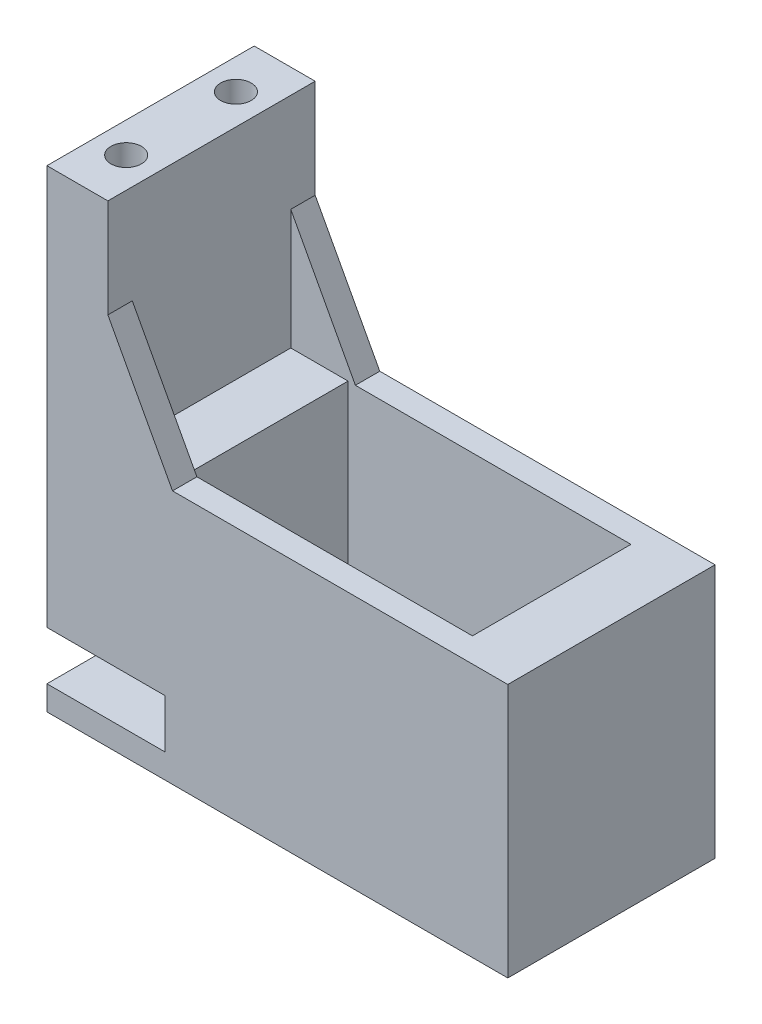
ISO-10303-21;
HEADER;
FILE_DESCRIPTION(('STEP AP214'),'2;1');
FILE_NAME('part.step','',(''),(''),'','','');
FILE_SCHEMA(('AUTOMOTIVE_DESIGN { 1 0 10303 214 1 1 1 1 }'));
ENDSEC;
DATA;
#1=APPLICATION_CONTEXT('core data for automotive mechanical design processes');
#2=APPLICATION_PROTOCOL_DEFINITION('international standard','automotive_design',2000,#1);
#3=PRODUCT_CONTEXT('',#1,'mechanical');
#4=PRODUCT('Part','Part','',(#3));
#5=PRODUCT_RELATED_PRODUCT_CATEGORY('part','',(#4));
#6=PRODUCT_DEFINITION_FORMATION('','',#4);
#7=PRODUCT_DEFINITION_CONTEXT('part definition',#1,'design');
#8=PRODUCT_DEFINITION('design','',#6,#7);
#9=PRODUCT_DEFINITION_SHAPE('','',#8);
#10=(LENGTH_UNIT() NAMED_UNIT(*) SI_UNIT(.MILLI.,.METRE.));
#11=(NAMED_UNIT(*) PLANE_ANGLE_UNIT() SI_UNIT($,.RADIAN.));
#12=(NAMED_UNIT(*) SI_UNIT($,.STERADIAN.) SOLID_ANGLE_UNIT());
#13=UNCERTAINTY_MEASURE_WITH_UNIT(LENGTH_MEASURE(1.E-05),#10,'distance_accuracy_value','');
#14=(GEOMETRIC_REPRESENTATION_CONTEXT(3) GLOBAL_UNCERTAINTY_ASSIGNED_CONTEXT((#13)) GLOBAL_UNIT_ASSIGNED_CONTEXT((#10,
#11,#12)) REPRESENTATION_CONTEXT('',''));
#15=CARTESIAN_POINT('',(0.,0.,0.));
#16=DIRECTION('',(0.,0.,1.));
#17=DIRECTION('',(1.,0.,0.));
#18=AXIS2_PLACEMENT_3D('',#15,#16,#17);
#19=CARTESIAN_POINT('',(-11.,5.15,8.5));
#20=DIRECTION('',(-0.880614595688984,-0.473833234228591,0.));
#21=DIRECTION('',(0.473833234228591,-0.880614595688984,0.));
#22=AXIS2_PLACEMENT_3D('',#19,#20,#21);
#23=PLANE('',#22);
#24=DIRECTION('',(0.,0.,-1.));
#25=VECTOR('',#24,1.);
#26=CARTESIAN_POINT('',(-16.3,15.,8.5));
#27=LINE('',#26,#25);
#28=CARTESIAN_POINT('',(-16.3,15.,-6.5));
#29=VERTEX_POINT('',#28);
#30=CARTESIAN_POINT('',(-16.3,15.,-8.5));
#31=VERTEX_POINT('',#30);
#32=EDGE_CURVE('E214',#29,#31,#27,.T.);
#33=ORIENTED_EDGE('',*,*,#32,.F.);
#34=DIRECTION('',(0.473833234228591,-0.880614595688984,0.));
#35=VECTOR('',#34,1.);
#36=CARTESIAN_POINT('',(-11.,5.15,-6.5));
#37=LINE('',#36,#35);
#38=CARTESIAN_POINT('',(-11.,5.15,-6.5));
#39=VERTEX_POINT('',#38);
#40=EDGE_CURVE('E342',#29,#39,#37,.T.);
#41=ORIENTED_EDGE('',*,*,#40,.T.);
#42=DIRECTION('',(0.,0.,-1.));
#43=VECTOR('',#42,1.);
#44=CARTESIAN_POINT('',(-11.,5.15,8.5));
#45=LINE('',#44,#43);
#46=CARTESIAN_POINT('',(-11.,5.15,-8.5));
#47=VERTEX_POINT('',#46);
#48=EDGE_CURVE('E218',#39,#47,#45,.T.);
#49=ORIENTED_EDGE('',*,*,#48,.T.);
#50=DIRECTION('',(-0.473833234228591,0.880614595688984,0.));
#51=VECTOR('',#50,1.);
#52=CARTESIAN_POINT('',(-11.,5.15,-8.5));
#53=LINE('',#52,#51);
#54=EDGE_CURVE('E210',#47,#31,#53,.T.);
#55=ORIENTED_EDGE('',*,*,#54,.T.);
#56=EDGE_LOOP('',(#33,#41,#49,#55));
#57=FACE_BOUND('',#56,.T.);
#58=ADVANCED_FACE('F37',(#57),#23,.F.);
#59=CARTESIAN_POINT('',(-21.3,5.15,8.5));
#60=DIRECTION('',(0.,-1.,0.));
#61=DIRECTION('',(0.,0.,-1.));
#62=AXIS2_PLACEMENT_3D('',#59,#60,#61);
#63=PLANE('',#62);
#64=CARTESIAN_POINT('',(-11.,5.15,8.5));
#65=VERTEX_POINT('',#64);
#66=CARTESIAN_POINT('',(-11.,5.15,6.5));
#67=VERTEX_POINT('',#66);
#68=EDGE_CURVE('E219',#65,#67,#45,.T.);
#69=ORIENTED_EDGE('',*,*,#68,.F.);
#70=DIRECTION('',(-1.,0.,0.));
#71=VECTOR('',#70,1.);
#72=CARTESIAN_POINT('',(-21.3,5.15,8.5));
#73=LINE('',#72,#71);
#74=CARTESIAN_POINT('',(16.5,5.15,8.5));
#75=VERTEX_POINT('',#74);
#76=EDGE_CURVE('E318',#75,#65,#73,.T.);
#77=ORIENTED_EDGE('',*,*,#76,.F.);
#78=DIRECTION('',(0.,0.,-1.));
#79=VECTOR('',#78,1.);
#80=CARTESIAN_POINT('',(16.5,5.15,8.5));
#81=LINE('',#80,#79);
#82=CARTESIAN_POINT('',(16.5,5.15,-8.5));
#83=VERTEX_POINT('',#82);
#84=EDGE_CURVE('E321',#75,#83,#81,.T.);
#85=ORIENTED_EDGE('',*,*,#84,.T.);
#86=DIRECTION('',(-1.,0.,0.));
#87=VECTOR('',#86,1.);
#88=CARTESIAN_POINT('',(-21.3,5.15,-8.5));
#89=LINE('',#88,#87);
#90=EDGE_CURVE('E329',#83,#47,#89,.T.);
#91=ORIENTED_EDGE('',*,*,#90,.T.);
#92=ORIENTED_EDGE('',*,*,#48,.F.);
#93=DIRECTION('',(-1.,0.,0.));
#94=VECTOR('',#93,1.);
#95=CARTESIAN_POINT('',(-11.6,5.15,-6.5));
#96=LINE('',#95,#94);
#97=CARTESIAN_POINT('',(11.6,5.15,-6.5));
#98=VERTEX_POINT('',#97);
#99=EDGE_CURVE('E272',#98,#39,#96,.T.);
#100=ORIENTED_EDGE('',*,*,#99,.F.);
#101=DIRECTION('',(0.,0.,-1.));
#102=VECTOR('',#101,1.);
#103=CARTESIAN_POINT('',(11.6,5.15,6.5));
#104=LINE('',#103,#102);
#105=CARTESIAN_POINT('',(11.6,5.15,6.5));
#106=VERTEX_POINT('',#105);
#107=EDGE_CURVE('E278',#106,#98,#104,.T.);
#108=ORIENTED_EDGE('',*,*,#107,.F.);
#109=DIRECTION('',(1.,0.,0.));
#110=VECTOR('',#109,1.);
#111=CARTESIAN_POINT('',(-11.6,5.15,6.5));
#112=LINE('',#111,#110);
#113=EDGE_CURVE('E276',#67,#106,#112,.T.);
#114=ORIENTED_EDGE('',*,*,#113,.F.);
#115=EDGE_LOOP('',(#69,#77,#85,#91,#92,#100,#108,#114));
#116=FACE_BOUND('',#115,.T.);
#117=ADVANCED_FACE('F385',(#116),#63,.F.);
#118=CARTESIAN_POINT('',(-16.3,5.15,8.5));
#119=DIRECTION('',(-1.,0.,0.));
#120=DIRECTION('',(0.,0.,1.));
#121=AXIS2_PLACEMENT_3D('',#118,#119,#120);
#122=PLANE('',#121);
#123=CARTESIAN_POINT('',(-16.3,15.,8.5));
#124=VERTEX_POINT('',#123);
#125=CARTESIAN_POINT('',(-16.3,15.,6.5));
#126=VERTEX_POINT('',#125);
#127=EDGE_CURVE('E186',#124,#126,#27,.T.);
#128=ORIENTED_EDGE('',*,*,#127,.T.);
#129=DIRECTION('',(0.,1.,0.));
#130=VECTOR('',#129,1.);
#131=CARTESIAN_POINT('',(-16.3,5.15,6.5));
#132=LINE('',#131,#130);
#133=CARTESIAN_POINT('',(-16.3,5.15,6.5));
#134=VERTEX_POINT('',#133);
#135=EDGE_CURVE('E179',#134,#126,#132,.T.);
#136=ORIENTED_EDGE('',*,*,#135,.F.);
#137=DIRECTION('',(0.,0.,1.));
#138=VECTOR('',#137,1.);
#139=CARTESIAN_POINT('',(-16.3,5.15,6.5));
#140=LINE('',#139,#138);
#141=CARTESIAN_POINT('',(-16.3,5.15,-6.5));
#142=VERTEX_POINT('',#141);
#143=EDGE_CURVE('E183',#142,#134,#140,.T.);
#144=ORIENTED_EDGE('',*,*,#143,.F.);
#145=DIRECTION('',(0.,1.,0.));
#146=VECTOR('',#145,1.);
#147=CARTESIAN_POINT('',(-16.3,5.15,-6.5));
#148=LINE('',#147,#146);
#149=EDGE_CURVE('E52',#142,#29,#148,.T.);
#150=ORIENTED_EDGE('',*,*,#149,.T.);
#151=ORIENTED_EDGE('',*,*,#32,.T.);
#152=DIRECTION('',(0.,1.,0.));
#153=VECTOR('',#152,1.);
#154=CARTESIAN_POINT('',(-16.3,5.15,-8.5));
#155=LINE('',#154,#153);
#156=CARTESIAN_POINT('',(-16.3,23.1,-8.5));
#157=VERTEX_POINT('',#156);
#158=EDGE_CURVE('E285',#31,#157,#155,.T.);
#159=ORIENTED_EDGE('',*,*,#158,.T.);
#160=DIRECTION('',(0.,0.,-1.));
#161=VECTOR('',#160,1.);
#162=CARTESIAN_POINT('',(-16.3,23.1,8.5));
#163=LINE('',#162,#161);
#164=CARTESIAN_POINT('',(-16.3,23.1,8.5));
#165=VERTEX_POINT('',#164);
#166=EDGE_CURVE('E306',#165,#157,#163,.T.);
#167=ORIENTED_EDGE('',*,*,#166,.F.);
#168=DIRECTION('',(0.,1.,0.));
#169=VECTOR('',#168,1.);
#170=CARTESIAN_POINT('',(-16.3,5.15,8.5));
#171=LINE('',#170,#169);
#172=EDGE_CURVE('E294',#124,#165,#171,.T.);
#173=ORIENTED_EDGE('',*,*,#172,.F.);
#174=EDGE_LOOP('',(#128,#136,#144,#150,#151,#159,#167,#173));
#175=FACE_BOUND('',#174,.T.);
#176=ADVANCED_FACE('F181',(#175),#122,.F.);
#177=CARTESIAN_POINT('',(-21.3,-15.7,8.5));
#178=DIRECTION('',(1.,0.,0.));
#179=DIRECTION('',(0.,0.,-1.));
#180=AXIS2_PLACEMENT_3D('',#177,#178,#179);
#181=PLANE('',#180);
#182=CARTESIAN_POINT('',(-21.3,4.,-4.));
#183=DIRECTION('',(1.,0.,0.));
#184=DIRECTION('',(0.,0.,-1.));
#185=AXIS2_PLACEMENT_3D('',#182,#183,#184);
#186=CIRCLE('',#185,1.5);
#187=CARTESIAN_POINT('',(-21.3,4.,-5.5));
#188=VERTEX_POINT('',#187);
#189=EDGE_CURVE('E11',#188,#188,#186,.F.);
#190=ORIENTED_EDGE('',*,*,#189,.F.);
#191=EDGE_LOOP('',(#190));
#192=FACE_BOUND('',#191,.T.);
#193=CARTESIAN_POINT('',(-21.3,4.,4.));
#194=DIRECTION('',(1.,0.,0.));
#195=DIRECTION('',(0.,0.,-1.));
#196=AXIS2_PLACEMENT_3D('',#193,#194,#195);
#197=CIRCLE('',#196,1.5);
#198=CARTESIAN_POINT('',(-21.3,4.,2.5));
#199=VERTEX_POINT('',#198);
#200=EDGE_CURVE('E45',#199,#199,#197,.F.);
#201=ORIENTED_EDGE('',*,*,#200,.F.);
#202=EDGE_LOOP('',(#201));
#203=FACE_BOUND('',#202,.T.);
#204=CARTESIAN_POINT('',(-21.3,-4.,-4.));
#205=DIRECTION('',(1.,0.,0.));
#206=DIRECTION('',(0.,0.,-1.));
#207=AXIS2_PLACEMENT_3D('',#204,#205,#206);
#208=CIRCLE('',#207,1.5);
#209=CARTESIAN_POINT('',(-21.3,-4.,-5.5));
#210=VERTEX_POINT('',#209);
#211=EDGE_CURVE('E350',#210,#210,#208,.F.);
#212=ORIENTED_EDGE('',*,*,#211,.F.);
#213=EDGE_LOOP('',(#212));
#214=FACE_BOUND('',#213,.T.);
#215=CARTESIAN_POINT('',(-21.3,-4.,4.));
#216=DIRECTION('',(1.,0.,0.));
#217=DIRECTION('',(0.,0.,-1.));
#218=AXIS2_PLACEMENT_3D('',#215,#216,#217);
#219=CIRCLE('',#218,1.5);
#220=CARTESIAN_POINT('',(-21.3,-4.,2.5));
#221=VERTEX_POINT('',#220);
#222=EDGE_CURVE('E347',#221,#221,#219,.F.);
#223=ORIENTED_EDGE('',*,*,#222,.F.);
#224=EDGE_LOOP('',(#223));
#225=FACE_BOUND('',#224,.T.);
#226=DIRECTION('',(0.,-1.,0.));
#227=VECTOR('',#226,1.);
#228=CARTESIAN_POINT('',(-21.3,-15.7,-8.5));
#229=LINE('',#228,#227);
#230=CARTESIAN_POINT('',(-21.3,23.1,-8.5));
#231=VERTEX_POINT('',#230);
#232=CARTESIAN_POINT('',(-21.3,-9.7,-8.5));
#233=VERTEX_POINT('',#232);
#234=EDGE_CURVE('E322',#231,#233,#229,.T.);
#235=ORIENTED_EDGE('',*,*,#234,.T.);
#236=DIRECTION('',(0.,0.,1.));
#237=VECTOR('',#236,1.);
#238=CARTESIAN_POINT('',(-21.3,-9.7,-8.5));
#239=LINE('',#238,#237);
#240=CARTESIAN_POINT('',(-21.3,-9.7,8.5));
#241=VERTEX_POINT('',#240);
#242=EDGE_CURVE('E238',#233,#241,#239,.T.);
#243=ORIENTED_EDGE('',*,*,#242,.T.);
#244=DIRECTION('',(0.,-1.,0.));
#245=VECTOR('',#244,1.);
#246=CARTESIAN_POINT('',(-21.3,-15.7,8.5));
#247=LINE('',#246,#245);
#248=CARTESIAN_POINT('',(-21.3,23.1,8.5));
#249=VERTEX_POINT('',#248);
#250=EDGE_CURVE('E310',#249,#241,#247,.T.);
#251=ORIENTED_EDGE('',*,*,#250,.F.);
#252=DIRECTION('',(0.,0.,-1.));
#253=VECTOR('',#252,1.);
#254=CARTESIAN_POINT('',(-21.3,23.1,8.5));
#255=LINE('',#254,#253);
#256=EDGE_CURVE('E300',#249,#231,#255,.T.);
#257=ORIENTED_EDGE('',*,*,#256,.T.);
#258=EDGE_LOOP('',(#235,#243,#251,#257));
#259=FACE_BOUND('',#258,.T.);
#260=ADVANCED_FACE('F358',(#192,#203,#214,#225,#259),#181,.F.);
#261=CARTESIAN_POINT('',(11.6,-13.7,6.5));
#262=DIRECTION('',(1.,0.,0.));
#263=DIRECTION('',(0.,0.,-1.));
#264=AXIS2_PLACEMENT_3D('',#261,#262,#263);
#265=PLANE('',#264);
#266=DIRECTION('',(0.,0.,1.));
#267=VECTOR('',#266,1.);
#268=CARTESIAN_POINT('',(11.6,-7.9,6.5));
#269=LINE('',#268,#267);
#270=CARTESIAN_POINT('',(11.6,-7.9,-6.5));
#271=VERTEX_POINT('',#270);
#272=CARTESIAN_POINT('',(11.6,-7.9,6.5));
#273=VERTEX_POINT('',#272);
#274=EDGE_CURVE('E251',#271,#273,#269,.T.);
#275=ORIENTED_EDGE('',*,*,#274,.T.);
#276=DIRECTION('',(0.,1.,0.));
#277=VECTOR('',#276,1.);
#278=CARTESIAN_POINT('',(11.6,-13.7,6.5));
#279=LINE('',#278,#277);
#280=EDGE_CURVE('E289',#273,#106,#279,.T.);
#281=ORIENTED_EDGE('',*,*,#280,.T.);
#282=ORIENTED_EDGE('',*,*,#107,.T.);
#283=DIRECTION('',(0.,1.,0.));
#284=VECTOR('',#283,1.);
#285=CARTESIAN_POINT('',(11.6,-13.7,-6.5));
#286=LINE('',#285,#284);
#287=EDGE_CURVE('E287',#271,#98,#286,.T.);
#288=ORIENTED_EDGE('',*,*,#287,.F.);
#289=EDGE_LOOP('',(#275,#281,#282,#288));
#290=FACE_BOUND('',#289,.T.);
#291=ADVANCED_FACE('F361',(#290),#265,.F.);
#292=CARTESIAN_POINT('',(-21.3,-13.7,8.5));
#293=VERTEX_POINT('',#292);
#294=CARTESIAN_POINT('',(-21.3,-15.7,8.5));
#295=VERTEX_POINT('',#294);
#296=EDGE_CURVE('E314',#293,#295,#247,.T.);
#297=ORIENTED_EDGE('',*,*,#296,.F.);
#298=DIRECTION('',(0.,0.,1.));
#299=VECTOR('',#298,1.);
#300=CARTESIAN_POINT('',(-21.3,-13.7,-8.5));
#301=LINE('',#300,#299);
#302=CARTESIAN_POINT('',(-21.3,-13.7,-8.5));
#303=VERTEX_POINT('',#302);
#304=EDGE_CURVE('E237',#303,#293,#301,.T.);
#305=ORIENTED_EDGE('',*,*,#304,.F.);
#306=CARTESIAN_POINT('',(-21.3,-15.7,-8.5));
#307=VERTEX_POINT('',#306);
#308=EDGE_CURVE('E309',#303,#307,#229,.T.);
#309=ORIENTED_EDGE('',*,*,#308,.T.);
#310=DIRECTION('',(0.,0.,-1.));
#311=VECTOR('',#310,1.);
#312=CARTESIAN_POINT('',(-21.3,-15.7,8.5));
#313=LINE('',#312,#311);
#314=EDGE_CURVE('E337',#295,#307,#313,.T.);
#315=ORIENTED_EDGE('',*,*,#314,.F.);
#316=EDGE_LOOP('',(#297,#305,#309,#315));
#317=FACE_BOUND('',#316,.T.);
#318=ADVANCED_FACE('F39',(#317),#181,.F.);
#319=CARTESIAN_POINT('',(-21.3,-15.7,8.5));
#320=DIRECTION('',(0.,1.,0.));
#321=DIRECTION('',(0.,0.,1.));
#322=AXIS2_PLACEMENT_3D('',#319,#320,#321);
#323=PLANE('',#322);
#324=CARTESIAN_POINT('',(5.5,-15.7,0.));
#325=DIRECTION('',(0.,1.,0.));
#326=DIRECTION('',(0.,0.,1.));
#327=AXIS2_PLACEMENT_3D('',#324,#325,#326);
#328=CIRCLE('',#327,3.);
#329=CARTESIAN_POINT('',(5.5,-15.7,3.));
#330=VERTEX_POINT('',#329);
#331=EDGE_CURVE('E344',#330,#330,#328,.F.);
#332=ORIENTED_EDGE('',*,*,#331,.F.);
#333=EDGE_LOOP('',(#332));
#334=FACE_BOUND('',#333,.T.);
#335=DIRECTION('',(1.,0.,0.));
#336=VECTOR('',#335,1.);
#337=CARTESIAN_POINT('',(-21.3,-15.7,-8.5));
#338=LINE('',#337,#336);
#339=CARTESIAN_POINT('',(16.5,-15.7,-8.5));
#340=VERTEX_POINT('',#339);
#341=EDGE_CURVE('E325',#307,#340,#338,.T.);
#342=ORIENTED_EDGE('',*,*,#341,.T.);
#343=DIRECTION('',(0.,0.,-1.));
#344=VECTOR('',#343,1.);
#345=CARTESIAN_POINT('',(16.5,-15.7,8.5));
#346=LINE('',#345,#344);
#347=CARTESIAN_POINT('',(16.5,-15.7,8.5));
#348=VERTEX_POINT('',#347);
#349=EDGE_CURVE('E334',#348,#340,#346,.T.);
#350=ORIENTED_EDGE('',*,*,#349,.F.);
#351=DIRECTION('',(1.,0.,0.));
#352=VECTOR('',#351,1.);
#353=CARTESIAN_POINT('',(-21.3,-15.7,8.5));
#354=LINE('',#353,#352);
#355=EDGE_CURVE('E313',#295,#348,#354,.T.);
#356=ORIENTED_EDGE('',*,*,#355,.F.);
#357=ORIENTED_EDGE('',*,*,#314,.T.);
#358=EDGE_LOOP('',(#342,#350,#356,#357));
#359=FACE_BOUND('',#358,.T.);
#360=ADVANCED_FACE('F398',(#334,#359),#323,.F.);
#361=CARTESIAN_POINT('',(16.5,-15.7,8.5));
#362=DIRECTION('',(-1.,0.,0.));
#363=DIRECTION('',(0.,0.,1.));
#364=AXIS2_PLACEMENT_3D('',#361,#362,#363);
#365=PLANE('',#364);
#366=DIRECTION('',(0.,1.,0.));
#367=VECTOR('',#366,1.);
#368=CARTESIAN_POINT('',(16.5,-15.7,-8.5));
#369=LINE('',#368,#367);
#370=EDGE_CURVE('E327',#340,#83,#369,.T.);
#371=ORIENTED_EDGE('',*,*,#370,.T.);
#372=ORIENTED_EDGE('',*,*,#84,.F.);
#373=DIRECTION('',(0.,1.,0.));
#374=VECTOR('',#373,1.);
#375=CARTESIAN_POINT('',(16.5,-15.7,8.5));
#376=LINE('',#375,#374);
#377=EDGE_CURVE('E316',#348,#75,#376,.T.);
#378=ORIENTED_EDGE('',*,*,#377,.F.);
#379=ORIENTED_EDGE('',*,*,#349,.T.);
#380=EDGE_LOOP('',(#371,#372,#378,#379));
#381=FACE_BOUND('',#380,.T.);
#382=ADVANCED_FACE('F391',(#381),#365,.F.);
#383=CARTESIAN_POINT('',(0.,0.,8.5));
#384=DIRECTION('',(0.,0.,-1.));
#385=DIRECTION('',(-1.,0.,0.));
#386=AXIS2_PLACEMENT_3D('',#383,#384,#385);
#387=PLANE('',#386);
#388=ORIENTED_EDGE('',*,*,#76,.T.);
#389=DIRECTION('',(-0.473833234228591,0.880614595688984,0.));
#390=VECTOR('',#389,1.);
#391=CARTESIAN_POINT('',(-11.,5.15,8.5));
#392=LINE('',#391,#390);
#393=EDGE_CURVE('E212',#65,#124,#392,.T.);
#394=ORIENTED_EDGE('',*,*,#393,.T.);
#395=ORIENTED_EDGE('',*,*,#172,.T.);
#396=DIRECTION('',(-1.,0.,0.));
#397=VECTOR('',#396,1.);
#398=CARTESIAN_POINT('',(-21.3,23.1,8.5));
#399=LINE('',#398,#397);
#400=EDGE_CURVE('E296',#165,#249,#399,.T.);
#401=ORIENTED_EDGE('',*,*,#400,.T.);
#402=ORIENTED_EDGE('',*,*,#250,.T.);
#403=DIRECTION('',(-1.,0.,0.));
#404=VECTOR('',#403,1.);
#405=CARTESIAN_POINT('',(-21.3,-9.7,8.5));
#406=LINE('',#405,#404);
#407=CARTESIAN_POINT('',(-11.6,-9.7,8.5));
#408=VERTEX_POINT('',#407);
#409=EDGE_CURVE('E228',#408,#241,#406,.T.);
#410=ORIENTED_EDGE('',*,*,#409,.F.);
#411=DIRECTION('',(0.,1.,0.));
#412=VECTOR('',#411,1.);
#413=CARTESIAN_POINT('',(-11.6,-13.7,8.5));
#414=LINE('',#413,#412);
#415=CARTESIAN_POINT('',(-11.6,-13.7,8.5));
#416=VERTEX_POINT('',#415);
#417=EDGE_CURVE('E225',#416,#408,#414,.T.);
#418=ORIENTED_EDGE('',*,*,#417,.F.);
#419=DIRECTION('',(1.,0.,0.));
#420=VECTOR('',#419,1.);
#421=CARTESIAN_POINT('',(-21.3,-13.7,8.5));
#422=LINE('',#421,#420);
#423=EDGE_CURVE('E222',#293,#416,#422,.T.);
#424=ORIENTED_EDGE('',*,*,#423,.F.);
#425=ORIENTED_EDGE('',*,*,#296,.T.);
#426=ORIENTED_EDGE('',*,*,#355,.T.);
#427=ORIENTED_EDGE('',*,*,#377,.T.);
#428=EDGE_LOOP('',(#388,#394,#395,#401,#402,#410,#418,#424,#425,#426,#427));
#429=FACE_BOUND('',#428,.T.);
#430=ADVANCED_FACE('F407',(#429),#387,.F.);
#431=CARTESIAN_POINT('',(0.,0.,-8.5));
#432=DIRECTION('',(0.,0.,-1.));
#433=DIRECTION('',(-1.,0.,0.));
#434=AXIS2_PLACEMENT_3D('',#431,#432,#433);
#435=PLANE('',#434);
#436=ORIENTED_EDGE('',*,*,#54,.F.);
#437=ORIENTED_EDGE('',*,*,#90,.F.);
#438=ORIENTED_EDGE('',*,*,#370,.F.);
#439=ORIENTED_EDGE('',*,*,#341,.F.);
#440=ORIENTED_EDGE('',*,*,#308,.F.);
#441=DIRECTION('',(1.,0.,0.));
#442=VECTOR('',#441,1.);
#443=CARTESIAN_POINT('',(-21.3,-13.7,-8.5));
#444=LINE('',#443,#442);
#445=CARTESIAN_POINT('',(-11.6,-13.7,-8.5));
#446=VERTEX_POINT('',#445);
#447=EDGE_CURVE('E230',#303,#446,#444,.T.);
#448=ORIENTED_EDGE('',*,*,#447,.T.);
#449=DIRECTION('',(0.,1.,0.));
#450=VECTOR('',#449,1.);
#451=CARTESIAN_POINT('',(-11.6,-13.7,-8.5));
#452=LINE('',#451,#450);
#453=CARTESIAN_POINT('',(-11.6,-9.7,-8.5));
#454=VERTEX_POINT('',#453);
#455=EDGE_CURVE('E60',#446,#454,#452,.T.);
#456=ORIENTED_EDGE('',*,*,#455,.T.);
#457=DIRECTION('',(-1.,0.,0.));
#458=VECTOR('',#457,1.);
#459=CARTESIAN_POINT('',(-21.3,-9.7,-8.5));
#460=LINE('',#459,#458);
#461=EDGE_CURVE('E234',#454,#233,#460,.T.);
#462=ORIENTED_EDGE('',*,*,#461,.T.);
#463=ORIENTED_EDGE('',*,*,#234,.F.);
#464=DIRECTION('',(-1.,0.,0.));
#465=VECTOR('',#464,1.);
#466=CARTESIAN_POINT('',(-21.3,23.1,-8.5));
#467=LINE('',#466,#465);
#468=EDGE_CURVE('E297',#157,#231,#467,.T.);
#469=ORIENTED_EDGE('',*,*,#468,.F.);
#470=ORIENTED_EDGE('',*,*,#158,.F.);
#471=EDGE_LOOP('',(#436,#437,#438,#439,#440,#448,#456,#462,#463,#469,#470));
#472=FACE_BOUND('',#471,.T.);
#473=ADVANCED_FACE('F371',(#472),#435,.T.);
#474=CARTESIAN_POINT('',(-21.3,23.1,8.5));
#475=DIRECTION('',(0.,-1.,0.));
#476=DIRECTION('',(0.,0.,-1.));
#477=AXIS2_PLACEMENT_3D('',#474,#475,#476);
#478=PLANE('',#477);
#479=CARTESIAN_POINT('',(-18.8,23.1,-4.5));
#480=DIRECTION('',(0.,1.,0.));
#481=DIRECTION('',(0.,0.,1.));
#482=AXIS2_PLACEMENT_3D('',#479,#480,#481);
#483=CIRCLE('',#482,1.25);
#484=CARTESIAN_POINT('',(-18.8,23.1,-3.25));
#485=VERTEX_POINT('',#484);
#486=EDGE_CURVE('E538',#485,#485,#483,.T.);
#487=ORIENTED_EDGE('',*,*,#486,.F.);
#488=EDGE_LOOP('',(#487));
#489=FACE_BOUND('',#488,.T.);
#490=CARTESIAN_POINT('',(-18.8,23.1,4.5));
#491=DIRECTION('',(0.,1.,0.));
#492=DIRECTION('',(0.,0.,1.));
#493=AXIS2_PLACEMENT_3D('',#490,#491,#492);
#494=CIRCLE('',#493,1.25);
#495=CARTESIAN_POINT('',(-18.8,23.1,5.75));
#496=VERTEX_POINT('',#495);
#497=EDGE_CURVE('E542',#496,#496,#494,.T.);
#498=ORIENTED_EDGE('',*,*,#497,.F.);
#499=EDGE_LOOP('',(#498));
#500=FACE_BOUND('',#499,.T.);
#501=ORIENTED_EDGE('',*,*,#468,.T.);
#502=ORIENTED_EDGE('',*,*,#256,.F.);
#503=ORIENTED_EDGE('',*,*,#400,.F.);
#504=ORIENTED_EDGE('',*,*,#166,.T.);
#505=EDGE_LOOP('',(#501,#502,#503,#504));
#506=FACE_BOUND('',#505,.T.);
#507=ADVANCED_FACE('F375',(#489,#500,#506),#478,.F.);
#508=CARTESIAN_POINT('',(-11.6,-13.7,6.5));
#509=DIRECTION('',(-1.,0.,0.));
#510=DIRECTION('',(0.,0.,1.));
#511=AXIS2_PLACEMENT_3D('',#508,#509,#510);
#512=PLANE('',#511);
#513=DIRECTION('',(0.,1.,0.));
#514=VECTOR('',#513,1.);
#515=CARTESIAN_POINT('',(-11.6,-13.7,6.5));
#516=LINE('',#515,#514);
#517=CARTESIAN_POINT('',(-11.6,-9.7,6.5));
#518=VERTEX_POINT('',#517);
#519=CARTESIAN_POINT('',(-11.6,5.15,6.5));
#520=VERTEX_POINT('',#519);
#521=EDGE_CURVE('E196',#518,#520,#516,.T.);
#522=ORIENTED_EDGE('',*,*,#521,.F.);
#523=DIRECTION('',(0.,0.,1.));
#524=VECTOR('',#523,1.);
#525=CARTESIAN_POINT('',(-11.6,-9.7,-8.5));
#526=LINE('',#525,#524);
#527=CARTESIAN_POINT('',(-11.6,-9.7,-6.5));
#528=VERTEX_POINT('',#527);
#529=EDGE_CURVE('E245',#528,#518,#526,.T.);
#530=ORIENTED_EDGE('',*,*,#529,.F.);
#531=DIRECTION('',(0.,1.,0.));
#532=VECTOR('',#531,1.);
#533=CARTESIAN_POINT('',(-11.6,-13.7,-6.5));
#534=LINE('',#533,#532);
#535=CARTESIAN_POINT('',(-11.6,5.15,-6.5));
#536=VERTEX_POINT('',#535);
#537=EDGE_CURVE('E286',#528,#536,#534,.T.);
#538=ORIENTED_EDGE('',*,*,#537,.T.);
#539=DIRECTION('',(0.,0.,1.));
#540=VECTOR('',#539,1.);
#541=CARTESIAN_POINT('',(-11.6,5.15,6.5));
#542=LINE('',#541,#540);
#543=EDGE_CURVE('E268',#536,#520,#542,.T.);
#544=ORIENTED_EDGE('',*,*,#543,.T.);
#545=EDGE_LOOP('',(#522,#530,#538,#544));
#546=FACE_BOUND('',#545,.T.);
#547=ADVANCED_FACE('F551',(#546),#512,.F.);
#548=CARTESIAN_POINT('',(-11.6,-13.7,-6.5));
#549=DIRECTION('',(0.,0.,-1.));
#550=DIRECTION('',(-1.,0.,0.));
#551=AXIS2_PLACEMENT_3D('',#548,#549,#550);
#552=PLANE('',#551);
#553=ORIENTED_EDGE('',*,*,#99,.T.);
#554=ORIENTED_EDGE('',*,*,#40,.F.);
#555=ORIENTED_EDGE('',*,*,#149,.F.);
#556=DIRECTION('',(-1.,0.,0.));
#557=VECTOR('',#556,1.);
#558=CARTESIAN_POINT('',(-16.3,5.15,-6.5));
#559=LINE('',#558,#557);
#560=EDGE_CURVE('E189',#536,#142,#559,.T.);
#561=ORIENTED_EDGE('',*,*,#560,.F.);
#562=ORIENTED_EDGE('',*,*,#537,.F.);
#563=CARTESIAN_POINT('',(-11.6,-13.7,-6.5));
#564=VERTEX_POINT('',#563);
#565=EDGE_CURVE('E283',#564,#528,#534,.T.);
#566=ORIENTED_EDGE('',*,*,#565,.F.);
#567=DIRECTION('',(-1.,0.,0.));
#568=VECTOR('',#567,1.);
#569=CARTESIAN_POINT('',(-11.6,-13.7,-6.5));
#570=LINE('',#569,#568);
#571=CARTESIAN_POINT('',(13.,-13.7,-6.5));
#572=VERTEX_POINT('',#571);
#573=EDGE_CURVE('E271',#572,#564,#570,.T.);
#574=ORIENTED_EDGE('',*,*,#573,.F.);
#575=DIRECTION('',(0.,-1.,0.));
#576=VECTOR('',#575,1.);
#577=CARTESIAN_POINT('',(13.,-7.9,-6.5));
#578=LINE('',#577,#576);
#579=CARTESIAN_POINT('',(13.,-7.9,-6.5));
#580=VERTEX_POINT('',#579);
#581=EDGE_CURVE('E260',#580,#572,#578,.T.);
#582=ORIENTED_EDGE('',*,*,#581,.F.);
#583=DIRECTION('',(-1.,0.,0.));
#584=VECTOR('',#583,1.);
#585=CARTESIAN_POINT('',(11.6,-7.9,-6.5));
#586=LINE('',#585,#584);
#587=EDGE_CURVE('E258',#580,#271,#586,.T.);
#588=ORIENTED_EDGE('',*,*,#587,.T.);
#589=ORIENTED_EDGE('',*,*,#287,.T.);
#590=EDGE_LOOP('',(#553,#554,#555,#561,#562,#566,#574,#582,#588,#589));
#591=FACE_BOUND('',#590,.T.);
#592=ADVANCED_FACE('F423',(#591),#552,.F.);
#593=CARTESIAN_POINT('',(-11.6,-13.7,6.5));
#594=DIRECTION('',(0.,0.,1.));
#595=DIRECTION('',(1.,0.,0.));
#596=AXIS2_PLACEMENT_3D('',#593,#594,#595);
#597=PLANE('',#596);
#598=ORIENTED_EDGE('',*,*,#521,.T.);
#599=DIRECTION('',(1.,0.,0.));
#600=VECTOR('',#599,1.);
#601=CARTESIAN_POINT('',(-16.3,5.15,6.5));
#602=LINE('',#601,#600);
#603=EDGE_CURVE('E192',#134,#520,#602,.T.);
#604=ORIENTED_EDGE('',*,*,#603,.F.);
#605=ORIENTED_EDGE('',*,*,#135,.T.);
#606=DIRECTION('',(-0.473833234228591,0.880614595688984,0.));
#607=VECTOR('',#606,1.);
#608=CARTESIAN_POINT('',(-11.,5.15,6.5));
#609=LINE('',#608,#607);
#610=EDGE_CURVE('E340',#67,#126,#609,.T.);
#611=ORIENTED_EDGE('',*,*,#610,.F.);
#612=ORIENTED_EDGE('',*,*,#113,.T.);
#613=ORIENTED_EDGE('',*,*,#280,.F.);
#614=DIRECTION('',(1.,0.,0.));
#615=VECTOR('',#614,1.);
#616=CARTESIAN_POINT('',(11.6,-7.9,6.5));
#617=LINE('',#616,#615);
#618=CARTESIAN_POINT('',(13.,-7.9,6.5));
#619=VERTEX_POINT('',#618);
#620=EDGE_CURVE('E254',#273,#619,#617,.T.);
#621=ORIENTED_EDGE('',*,*,#620,.T.);
#622=DIRECTION('',(0.,-1.,0.));
#623=VECTOR('',#622,1.);
#624=CARTESIAN_POINT('',(13.,-7.9,6.5));
#625=LINE('',#624,#623);
#626=CARTESIAN_POINT('',(13.,-13.7,6.5));
#627=VERTEX_POINT('',#626);
#628=EDGE_CURVE('E265',#619,#627,#625,.T.);
#629=ORIENTED_EDGE('',*,*,#628,.T.);
#630=DIRECTION('',(1.,0.,0.));
#631=VECTOR('',#630,1.);
#632=CARTESIAN_POINT('',(-11.6,-13.7,6.5));
#633=LINE('',#632,#631);
#634=CARTESIAN_POINT('',(-11.6,-13.7,6.5));
#635=VERTEX_POINT('',#634);
#636=EDGE_CURVE('E269',#635,#627,#633,.T.);
#637=ORIENTED_EDGE('',*,*,#636,.F.);
#638=EDGE_CURVE('E292',#635,#518,#516,.T.);
#639=ORIENTED_EDGE('',*,*,#638,.T.);
#640=EDGE_LOOP('',(#598,#604,#605,#611,#612,#613,#621,#629,#637,#639));
#641=FACE_BOUND('',#640,.T.);
#642=ADVANCED_FACE('F193',(#641),#597,.F.);
#643=CARTESIAN_POINT('',(0.,-13.7,0.));
#644=DIRECTION('',(0.,-1.,0.));
#645=DIRECTION('',(0.,0.,-1.));
#646=AXIS2_PLACEMENT_3D('',#643,#644,#645);
#647=PLANE('',#646);
#648=ORIENTED_EDGE('',*,*,#573,.T.);
#649=DIRECTION('',(0.,0.,1.));
#650=VECTOR('',#649,1.);
#651=CARTESIAN_POINT('',(-11.6,-13.7,-8.5));
#652=LINE('',#651,#650);
#653=EDGE_CURVE('E247',#446,#564,#652,.T.);
#654=ORIENTED_EDGE('',*,*,#653,.F.);
#655=ORIENTED_EDGE('',*,*,#447,.F.);
#656=ORIENTED_EDGE('',*,*,#304,.T.);
#657=ORIENTED_EDGE('',*,*,#423,.T.);
#658=EDGE_CURVE('E249',#635,#416,#652,.T.);
#659=ORIENTED_EDGE('',*,*,#658,.F.);
#660=ORIENTED_EDGE('',*,*,#636,.T.);
#661=DIRECTION('',(0.,0.,-1.));
#662=VECTOR('',#661,1.);
#663=CARTESIAN_POINT('',(13.,-13.7,6.5));
#664=LINE('',#663,#662);
#665=EDGE_CURVE('E241',#627,#572,#664,.T.);
#666=ORIENTED_EDGE('',*,*,#665,.T.);
#667=EDGE_LOOP('',(#648,#654,#655,#656,#657,#659,#660,#666));
#668=FACE_BOUND('',#667,.T.);
#669=ADVANCED_FACE('F404',(#668),#647,.F.);
#670=CARTESIAN_POINT('',(13.,-7.9,6.5));
#671=DIRECTION('',(-1.,0.,0.));
#672=DIRECTION('',(0.,0.,1.));
#673=AXIS2_PLACEMENT_3D('',#670,#671,#672);
#674=PLANE('',#673);
#675=ORIENTED_EDGE('',*,*,#665,.F.);
#676=ORIENTED_EDGE('',*,*,#628,.F.);
#677=DIRECTION('',(0.,0.,-1.));
#678=VECTOR('',#677,1.);
#679=CARTESIAN_POINT('',(13.,-7.9,6.5));
#680=LINE('',#679,#678);
#681=EDGE_CURVE('E256',#619,#580,#680,.T.);
#682=ORIENTED_EDGE('',*,*,#681,.T.);
#683=ORIENTED_EDGE('',*,*,#581,.T.);
#684=EDGE_LOOP('',(#675,#676,#682,#683));
#685=FACE_BOUND('',#684,.T.);
#686=ADVANCED_FACE('F419',(#685),#674,.T.);
#687=CARTESIAN_POINT('',(0.,-7.9,0.));
#688=DIRECTION('',(0.,-1.,0.));
#689=DIRECTION('',(0.,0.,-1.));
#690=AXIS2_PLACEMENT_3D('',#687,#688,#689);
#691=PLANE('',#690);
#692=ORIENTED_EDGE('',*,*,#274,.F.);
#693=ORIENTED_EDGE('',*,*,#587,.F.);
#694=ORIENTED_EDGE('',*,*,#681,.F.);
#695=ORIENTED_EDGE('',*,*,#620,.F.);
#696=EDGE_LOOP('',(#692,#693,#694,#695));
#697=FACE_BOUND('',#696,.T.);
#698=ADVANCED_FACE('F427',(#697),#691,.T.);
#699=CARTESIAN_POINT('',(-11.6,-13.7,-8.5));
#700=DIRECTION('',(1.,0.,0.));
#701=DIRECTION('',(0.,0.,-1.));
#702=AXIS2_PLACEMENT_3D('',#699,#700,#701);
#703=PLANE('',#702);
#704=EDGE_CURVE('E242',#454,#528,#526,.T.);
#705=ORIENTED_EDGE('',*,*,#704,.F.);
#706=ORIENTED_EDGE('',*,*,#455,.F.);
#707=ORIENTED_EDGE('',*,*,#653,.T.);
#708=ORIENTED_EDGE('',*,*,#565,.T.);
#709=EDGE_LOOP('',(#705,#706,#707,#708));
#710=FACE_BOUND('',#709,.T.);
#711=ADVANCED_FACE('F754',(#710),#703,.F.);
#712=ORIENTED_EDGE('',*,*,#658,.T.);
#713=ORIENTED_EDGE('',*,*,#417,.T.);
#714=EDGE_CURVE('E246',#518,#408,#526,.T.);
#715=ORIENTED_EDGE('',*,*,#714,.F.);
#716=ORIENTED_EDGE('',*,*,#638,.F.);
#717=EDGE_LOOP('',(#712,#713,#715,#716));
#718=FACE_BOUND('',#717,.T.);
#719=ADVANCED_FACE('F410',(#718),#703,.F.);
#720=CARTESIAN_POINT('',(-21.3,-9.7,-8.5));
#721=DIRECTION('',(0.,1.,0.));
#722=DIRECTION('',(0.,0.,1.));
#723=AXIS2_PLACEMENT_3D('',#720,#721,#722);
#724=PLANE('',#723);
#725=ORIENTED_EDGE('',*,*,#242,.F.);
#726=ORIENTED_EDGE('',*,*,#461,.F.);
#727=ORIENTED_EDGE('',*,*,#704,.T.);
#728=ORIENTED_EDGE('',*,*,#529,.T.);
#729=ORIENTED_EDGE('',*,*,#714,.T.);
#730=ORIENTED_EDGE('',*,*,#409,.T.);
#731=EDGE_LOOP('',(#725,#726,#727,#728,#729,#730));
#732=FACE_BOUND('',#731,.T.);
#733=ADVANCED_FACE('F435',(#732),#724,.F.);
#734=ORIENTED_EDGE('',*,*,#68,.T.);
#735=ORIENTED_EDGE('',*,*,#610,.T.);
#736=ORIENTED_EDGE('',*,*,#127,.F.);
#737=ORIENTED_EDGE('',*,*,#393,.F.);
#738=EDGE_LOOP('',(#734,#735,#736,#737));
#739=FACE_BOUND('',#738,.T.);
#740=ADVANCED_FACE('F433',(#739),#23,.F.);
#741=CARTESIAN_POINT('',(0.,5.15,0.));
#742=DIRECTION('',(0.,-1.,0.));
#743=DIRECTION('',(0.,0.,-1.));
#744=AXIS2_PLACEMENT_3D('',#741,#742,#743);
#745=PLANE('',#744);
#746=ORIENTED_EDGE('',*,*,#560,.T.);
#747=ORIENTED_EDGE('',*,*,#143,.T.);
#748=ORIENTED_EDGE('',*,*,#603,.T.);
#749=ORIENTED_EDGE('',*,*,#543,.F.);
#750=EDGE_LOOP('',(#746,#747,#748,#749));
#751=FACE_BOUND('',#750,.T.);
#752=ADVANCED_FACE('F200',(#751),#745,.F.);
#753=CARTESIAN_POINT('',(5.5,-15.7,0.));
#754=DIRECTION('',(0.,-1.,0.));
#755=DIRECTION('',(0.,0.,-1.));
#756=AXIS2_PLACEMENT_3D('',#753,#754,#755);
#757=CYLINDRICAL_SURFACE('',#756,3.);
#758=ORIENTED_EDGE('',*,*,#331,.T.);
#759=EDGE_LOOP('',(#758));
#760=FACE_BOUND('',#759,.T.);
#761=CARTESIAN_POINT('',(5.5,-18.7,0.));
#762=DIRECTION('',(0.,1.,0.));
#763=DIRECTION('',(0.,0.,1.));
#764=AXIS2_PLACEMENT_3D('',#761,#762,#763);
#765=CIRCLE('',#764,3.);
#766=CARTESIAN_POINT('',(5.5,-18.7,3.));
#767=VERTEX_POINT('',#766);
#768=EDGE_CURVE('E202',#767,#767,#765,.T.);
#769=ORIENTED_EDGE('',*,*,#768,.T.);
#770=EDGE_LOOP('',(#769));
#771=FACE_BOUND('',#770,.T.);
#772=ADVANCED_FACE('F441',(#760,#771),#757,.T.);
#773=CARTESIAN_POINT('',(5.5,-18.7,0.));
#774=DIRECTION('',(0.,1.,0.));
#775=DIRECTION('',(0.,0.,1.));
#776=AXIS2_PLACEMENT_3D('',#773,#774,#775);
#777=PLANE('',#776);
#778=ORIENTED_EDGE('',*,*,#768,.F.);
#779=EDGE_LOOP('',(#778));
#780=FACE_BOUND('',#779,.T.);
#781=ADVANCED_FACE('F467',(#780),#777,.F.);
#782=CARTESIAN_POINT('',(-18.8,18.8,4.5));
#783=DIRECTION('',(0.,1.,0.));
#784=DIRECTION('',(0.,0.,1.));
#785=AXIS2_PLACEMENT_3D('',#782,#783,#784);
#786=CYLINDRICAL_SURFACE('',#785,1.25);
#787=CARTESIAN_POINT('',(-18.8,18.8,4.5));
#788=DIRECTION('',(0.,1.,0.));
#789=DIRECTION('',(0.,0.,1.));
#790=AXIS2_PLACEMENT_3D('',#787,#788,#789);
#791=CIRCLE('',#790,1.25);
#792=CARTESIAN_POINT('',(-18.8,18.8,5.75));
#793=VERTEX_POINT('',#792);
#794=EDGE_CURVE('E205',#793,#793,#791,.T.);
#795=CARTESIAN_POINT('',(-18.8,18.8,5.75));
#796=CARTESIAN_POINT('',(-18.8,18.8447916666667,5.75));
#797=CARTESIAN_POINT('',(-18.8,18.8895833333333,5.75));
#798=CARTESIAN_POINT('',(-18.8,18.9791666666667,5.75));
#799=CARTESIAN_POINT('',(-18.8,19.0239583333333,5.75));
#800=CARTESIAN_POINT('',(-18.8,19.1135416666667,5.75));
#801=CARTESIAN_POINT('',(-18.8,19.1583333333333,5.75));
#802=CARTESIAN_POINT('',(-18.8,19.2479166666667,5.75));
#803=CARTESIAN_POINT('',(-18.8,19.2927083333333,5.75));
#804=CARTESIAN_POINT('',(-18.8,19.3822916666667,5.75));
#805=CARTESIAN_POINT('',(-18.8,19.4270833333333,5.75));
#806=CARTESIAN_POINT('',(-18.8,19.5166666666667,5.75));
#807=CARTESIAN_POINT('',(-18.8,19.5614583333333,5.75));
#808=CARTESIAN_POINT('',(-18.8,19.6510416666667,5.75));
#809=CARTESIAN_POINT('',(-18.8,19.6958333333333,5.75));
#810=CARTESIAN_POINT('',(-18.8,19.7854166666667,5.75));
#811=CARTESIAN_POINT('',(-18.8,19.8302083333333,5.75));
#812=CARTESIAN_POINT('',(-18.8,19.9197916666667,5.75));
#813=CARTESIAN_POINT('',(-18.8,19.9645833333333,5.75));
#814=CARTESIAN_POINT('',(-18.8,20.0541666666667,5.75));
#815=CARTESIAN_POINT('',(-18.8,20.0989583333333,5.75));
#816=CARTESIAN_POINT('',(-18.8,20.1885416666667,5.75));
#817=CARTESIAN_POINT('',(-18.8,20.2333333333333,5.75));
#818=CARTESIAN_POINT('',(-18.8,20.3229166666667,5.75));
#819=CARTESIAN_POINT('',(-18.8,20.3677083333333,5.75));
#820=CARTESIAN_POINT('',(-18.8,20.4572916666667,5.75));
#821=CARTESIAN_POINT('',(-18.8,20.5020833333333,5.75));
#822=CARTESIAN_POINT('',(-18.8,20.5916666666667,5.75));
#823=CARTESIAN_POINT('',(-18.8,20.6364583333333,5.75));
#824=CARTESIAN_POINT('',(-18.8,20.7260416666667,5.75));
#825=CARTESIAN_POINT('',(-18.8,20.7708333333333,5.75));
#826=CARTESIAN_POINT('',(-18.8,20.8604166666667,5.75));
#827=CARTESIAN_POINT('',(-18.8,20.9052083333333,5.75));
#828=CARTESIAN_POINT('',(-18.8,20.9947916666667,5.75));
#829=CARTESIAN_POINT('',(-18.8,21.0395833333333,5.75));
#830=CARTESIAN_POINT('',(-18.8,21.1291666666667,5.75));
#831=CARTESIAN_POINT('',(-18.8,21.1739583333333,5.75));
#832=CARTESIAN_POINT('',(-18.8,21.2635416666667,5.75));
#833=CARTESIAN_POINT('',(-18.8,21.3083333333333,5.75));
#834=CARTESIAN_POINT('',(-18.8,21.3979166666667,5.75));
#835=CARTESIAN_POINT('',(-18.8,21.4427083333333,5.75));
#836=CARTESIAN_POINT('',(-18.8,21.5322916666667,5.75));
#837=CARTESIAN_POINT('',(-18.8,21.5770833333333,5.75));
#838=CARTESIAN_POINT('',(-18.8,21.6666666666667,5.75));
#839=CARTESIAN_POINT('',(-18.8,21.7114583333333,5.75));
#840=CARTESIAN_POINT('',(-18.8,21.8010416666667,5.75));
#841=CARTESIAN_POINT('',(-18.8,21.8458333333333,5.75));
#842=CARTESIAN_POINT('',(-18.8,21.9354166666667,5.75));
#843=CARTESIAN_POINT('',(-18.8,21.9802083333333,5.75));
#844=CARTESIAN_POINT('',(-18.8,22.0697916666667,5.75));
#845=CARTESIAN_POINT('',(-18.8,22.1145833333333,5.75));
#846=CARTESIAN_POINT('',(-18.8,22.2041666666667,5.75));
#847=CARTESIAN_POINT('',(-18.8,22.2489583333333,5.75));
#848=CARTESIAN_POINT('',(-18.8,22.3385416666667,5.75));
#849=CARTESIAN_POINT('',(-18.8,22.3833333333333,5.75));
#850=CARTESIAN_POINT('',(-18.8,22.4729166666667,5.75));
#851=CARTESIAN_POINT('',(-18.8,22.5177083333333,5.75));
#852=CARTESIAN_POINT('',(-18.8,22.6072916666667,5.75));
#853=CARTESIAN_POINT('',(-18.8,22.6520833333333,5.75));
#854=CARTESIAN_POINT('',(-18.8,22.7416666666667,5.75));
#855=CARTESIAN_POINT('',(-18.8,22.7864583333333,5.75));
#856=CARTESIAN_POINT('',(-18.8,22.8760416666667,5.75));
#857=CARTESIAN_POINT('',(-18.8,22.9208333333333,5.75));
#858=CARTESIAN_POINT('',(-18.8,23.0104166666667,5.75));
#859=CARTESIAN_POINT('',(-18.8,23.0552083333333,5.75));
#860=CARTESIAN_POINT('',(-18.8,23.1,5.75));
#861=B_SPLINE_CURVE_WITH_KNOTS('',3,(#795,#796,#797,#798,#799,#800,#801,#802,#803,#804,#805,
#806,#807,#808,#809,#810,#811,#812,#813,#814,#815,#816,#817,#818,#819,#820,#821,#822,#823,#824,
#825,#826,#827,#828,#829,#830,#831,#832,#833,#834,#835,#836,#837,#838,#839,#840,#841,#842,#843,
#844,#845,#846,#847,#848,#849,#850,#851,#852,#853,#854,#855,#856,#857,#858,#859,#860),
.UNSPECIFIED.,.F.,.F.,(4,2,2,2,2,2,2,2,2,2,2,2,2,2,2,2,2,2,2,2,2,2,2,2,2,2,2,2,2,2,2,2,4),(0.,
0.134374999999999,0.268749999999998,0.403124999999997,0.5375,0.671874999999999,
0.806249999999998,0.940625,1.075,1.209375,1.34375,1.478125,1.6125,1.746875,1.88125,2.015625,
2.15,2.284375,2.41875,2.553125,2.6875,2.821875,2.95625,3.090625,3.225,3.359375,3.49375,3.628125,
3.7625,3.896875,4.03125,4.165625,4.3),.UNSPECIFIED.);
#862=EDGE_CURVE('BSEAM472',#793,#496,#861,.T.);
#863=ORIENTED_EDGE('',*,*,#794,.F.);
#864=ORIENTED_EDGE('',*,*,#497,.T.);
#865=ORIENTED_EDGE('',*,*,#862,.T.);
#866=ORIENTED_EDGE('',*,*,#862,.F.);
#867=EDGE_LOOP('',(#863,#865,#864,#866));
#868=FACE_BOUND('',#867,.T.);
#869=ADVANCED_FACE('F472',(#868),#786,.F.);
#870=CARTESIAN_POINT('',(-18.8,18.8,4.5));
#871=DIRECTION('',(0.,1.,0.));
#872=DIRECTION('',(0.,0.,1.));
#873=AXIS2_PLACEMENT_3D('',#870,#871,#872);
#874=PLANE('',#873);
#875=ORIENTED_EDGE('',*,*,#794,.T.);
#876=EDGE_LOOP('',(#875));
#877=FACE_BOUND('',#876,.T.);
#878=ADVANCED_FACE('F477',(#877),#874,.T.);
#879=CARTESIAN_POINT('',(-18.8,18.8,-4.5));
#880=DIRECTION('',(0.,1.,0.));
#881=DIRECTION('',(0.,0.,1.));
#882=AXIS2_PLACEMENT_3D('',#879,#880,#881);
#883=CYLINDRICAL_SURFACE('',#882,1.25);
#884=CARTESIAN_POINT('',(-18.8,18.8,-4.5));
#885=DIRECTION('',(0.,1.,0.));
#886=DIRECTION('',(0.,0.,1.));
#887=AXIS2_PLACEMENT_3D('',#884,#885,#886);
#888=CIRCLE('',#887,1.25);
#889=CARTESIAN_POINT('',(-18.8,18.8,-3.25));
#890=VERTEX_POINT('',#889);
#891=EDGE_CURVE('E539',#890,#890,#888,.T.);
#892=CARTESIAN_POINT('',(-18.8,18.8,-3.25));
#893=CARTESIAN_POINT('',(-18.8,18.8447916666667,-3.25));
#894=CARTESIAN_POINT('',(-18.8,18.8895833333333,-3.25));
#895=CARTESIAN_POINT('',(-18.8,18.9791666666667,-3.25));
#896=CARTESIAN_POINT('',(-18.8,19.0239583333333,-3.25));
#897=CARTESIAN_POINT('',(-18.8,19.1135416666667,-3.25));
#898=CARTESIAN_POINT('',(-18.8,19.1583333333333,-3.25));
#899=CARTESIAN_POINT('',(-18.8,19.2479166666667,-3.25));
#900=CARTESIAN_POINT('',(-18.8,19.2927083333333,-3.25));
#901=CARTESIAN_POINT('',(-18.8,19.3822916666667,-3.25));
#902=CARTESIAN_POINT('',(-18.8,19.4270833333333,-3.25));
#903=CARTESIAN_POINT('',(-18.8,19.5166666666667,-3.25));
#904=CARTESIAN_POINT('',(-18.8,19.5614583333333,-3.25));
#905=CARTESIAN_POINT('',(-18.8,19.6510416666667,-3.25));
#906=CARTESIAN_POINT('',(-18.8,19.6958333333333,-3.25));
#907=CARTESIAN_POINT('',(-18.8,19.7854166666667,-3.25));
#908=CARTESIAN_POINT('',(-18.8,19.8302083333333,-3.25));
#909=CARTESIAN_POINT('',(-18.8,19.9197916666667,-3.25));
#910=CARTESIAN_POINT('',(-18.8,19.9645833333333,-3.25));
#911=CARTESIAN_POINT('',(-18.8,20.0541666666667,-3.25));
#912=CARTESIAN_POINT('',(-18.8,20.0989583333333,-3.25));
#913=CARTESIAN_POINT('',(-18.8,20.1885416666667,-3.25));
#914=CARTESIAN_POINT('',(-18.8,20.2333333333333,-3.25));
#915=CARTESIAN_POINT('',(-18.8,20.3229166666667,-3.25));
#916=CARTESIAN_POINT('',(-18.8,20.3677083333333,-3.25));
#917=CARTESIAN_POINT('',(-18.8,20.4572916666667,-3.25));
#918=CARTESIAN_POINT('',(-18.8,20.5020833333333,-3.25));
#919=CARTESIAN_POINT('',(-18.8,20.5916666666667,-3.25));
#920=CARTESIAN_POINT('',(-18.8,20.6364583333333,-3.25));
#921=CARTESIAN_POINT('',(-18.8,20.7260416666667,-3.25));
#922=CARTESIAN_POINT('',(-18.8,20.7708333333333,-3.25));
#923=CARTESIAN_POINT('',(-18.8,20.8604166666667,-3.25));
#924=CARTESIAN_POINT('',(-18.8,20.9052083333333,-3.25));
#925=CARTESIAN_POINT('',(-18.8,20.9947916666667,-3.25));
#926=CARTESIAN_POINT('',(-18.8,21.0395833333333,-3.25));
#927=CARTESIAN_POINT('',(-18.8,21.1291666666667,-3.25));
#928=CARTESIAN_POINT('',(-18.8,21.1739583333333,-3.25));
#929=CARTESIAN_POINT('',(-18.8,21.2635416666667,-3.25));
#930=CARTESIAN_POINT('',(-18.8,21.3083333333333,-3.25));
#931=CARTESIAN_POINT('',(-18.8,21.3979166666667,-3.25));
#932=CARTESIAN_POINT('',(-18.8,21.4427083333333,-3.25));
#933=CARTESIAN_POINT('',(-18.8,21.5322916666667,-3.25));
#934=CARTESIAN_POINT('',(-18.8,21.5770833333333,-3.25));
#935=CARTESIAN_POINT('',(-18.8,21.6666666666667,-3.25));
#936=CARTESIAN_POINT('',(-18.8,21.7114583333333,-3.25));
#937=CARTESIAN_POINT('',(-18.8,21.8010416666667,-3.25));
#938=CARTESIAN_POINT('',(-18.8,21.8458333333333,-3.25));
#939=CARTESIAN_POINT('',(-18.8,21.9354166666667,-3.25));
#940=CARTESIAN_POINT('',(-18.8,21.9802083333333,-3.25));
#941=CARTESIAN_POINT('',(-18.8,22.0697916666667,-3.25));
#942=CARTESIAN_POINT('',(-18.8,22.1145833333333,-3.25));
#943=CARTESIAN_POINT('',(-18.8,22.2041666666667,-3.25));
#944=CARTESIAN_POINT('',(-18.8,22.2489583333333,-3.25));
#945=CARTESIAN_POINT('',(-18.8,22.3385416666667,-3.25));
#946=CARTESIAN_POINT('',(-18.8,22.3833333333333,-3.25));
#947=CARTESIAN_POINT('',(-18.8,22.4729166666667,-3.25));
#948=CARTESIAN_POINT('',(-18.8,22.5177083333333,-3.25));
#949=CARTESIAN_POINT('',(-18.8,22.6072916666667,-3.25));
#950=CARTESIAN_POINT('',(-18.8,22.6520833333333,-3.25));
#951=CARTESIAN_POINT('',(-18.8,22.7416666666667,-3.25));
#952=CARTESIAN_POINT('',(-18.8,22.7864583333333,-3.25));
#953=CARTESIAN_POINT('',(-18.8,22.8760416666667,-3.25));
#954=CARTESIAN_POINT('',(-18.8,22.9208333333333,-3.25));
#955=CARTESIAN_POINT('',(-18.8,23.0104166666667,-3.25));
#956=CARTESIAN_POINT('',(-18.8,23.0552083333333,-3.25));
#957=CARTESIAN_POINT('',(-18.8,23.1,-3.25));
#958=B_SPLINE_CURVE_WITH_KNOTS('',3,(#892,#893,#894,#895,#896,#897,#898,#899,#900,#901,#902,
#903,#904,#905,#906,#907,#908,#909,#910,#911,#912,#913,#914,#915,#916,#917,#918,#919,#920,#921,
#922,#923,#924,#925,#926,#927,#928,#929,#930,#931,#932,#933,#934,#935,#936,#937,#938,#939,#940,
#941,#942,#943,#944,#945,#946,#947,#948,#949,#950,#951,#952,#953,#954,#955,#956,#957),
.UNSPECIFIED.,.F.,.F.,(4,2,2,2,2,2,2,2,2,2,2,2,2,2,2,2,2,2,2,2,2,2,2,2,2,2,2,2,2,2,2,2,4),(0.,
0.134374999999999,0.268749999999998,0.403124999999997,0.5375,0.671874999999999,
0.806249999999998,0.940625,1.075,1.209375,1.34375,1.478125,1.6125,1.746875,1.88125,2.015625,
2.15,2.284375,2.41875,2.553125,2.6875,2.821875,2.95625,3.090625,3.225,3.359375,3.49375,3.628125,
3.7625,3.896875,4.03125,4.165625,4.3),.UNSPECIFIED.);
#959=EDGE_CURVE('BSEAM483',#890,#485,#958,.T.);
#960=ORIENTED_EDGE('',*,*,#891,.F.);
#961=ORIENTED_EDGE('',*,*,#486,.T.);
#962=ORIENTED_EDGE('',*,*,#959,.T.);
#963=ORIENTED_EDGE('',*,*,#959,.F.);
#964=EDGE_LOOP('',(#960,#962,#961,#963));
#965=FACE_BOUND('',#964,.T.);
#966=ADVANCED_FACE('F483',(#965),#883,.F.);
#967=CARTESIAN_POINT('',(-18.8,18.8,-4.5));
#968=DIRECTION('',(0.,1.,0.));
#969=DIRECTION('',(0.,0.,1.));
#970=AXIS2_PLACEMENT_3D('',#967,#968,#969);
#971=PLANE('',#970);
#972=ORIENTED_EDGE('',*,*,#891,.T.);
#973=EDGE_LOOP('',(#972));
#974=FACE_BOUND('',#973,.T.);
#975=ADVANCED_FACE('F487',(#974),#971,.T.);
#976=CARTESIAN_POINT('',(-21.3,-4.,4.));
#977=DIRECTION('',(-1.,0.,0.));
#978=DIRECTION('',(0.,0.,1.));
#979=AXIS2_PLACEMENT_3D('',#976,#977,#978);
#980=CYLINDRICAL_SURFACE('',#979,1.5);
#981=ORIENTED_EDGE('',*,*,#222,.T.);
#982=EDGE_LOOP('',(#981));
#983=FACE_BOUND('',#982,.T.);
#984=CARTESIAN_POINT('',(-24.1,-4.,4.));
#985=DIRECTION('',(1.,0.,0.));
#986=DIRECTION('',(0.,0.,-1.));
#987=AXIS2_PLACEMENT_3D('',#984,#985,#986);
#988=CIRCLE('',#987,1.5);
#989=CARTESIAN_POINT('',(-24.1,-4.,2.5));
#990=VERTEX_POINT('',#989);
#991=EDGE_CURVE('E535',#990,#990,#988,.T.);
#992=ORIENTED_EDGE('',*,*,#991,.T.);
#993=EDGE_LOOP('',(#992));
#994=FACE_BOUND('',#993,.T.);
#995=ADVANCED_FACE('F491',(#983,#994),#980,.T.);
#996=CARTESIAN_POINT('',(-24.1,-4.,4.));
#997=DIRECTION('',(1.,0.,0.));
#998=DIRECTION('',(0.,0.,-1.));
#999=AXIS2_PLACEMENT_3D('',#996,#997,#998);
#1000=PLANE('',#999);
#1001=ORIENTED_EDGE('',*,*,#991,.F.);
#1002=EDGE_LOOP('',(#1001));
#1003=FACE_BOUND('',#1002,.T.);
#1004=ADVANCED_FACE('F495',(#1003),#1000,.F.);
#1005=CARTESIAN_POINT('',(-21.3,-4.,-4.));
#1006=DIRECTION('',(-1.,0.,0.));
#1007=DIRECTION('',(0.,0.,1.));
#1008=AXIS2_PLACEMENT_3D('',#1005,#1006,#1007);
#1009=CYLINDRICAL_SURFACE('',#1008,1.5);
#1010=ORIENTED_EDGE('',*,*,#211,.T.);
#1011=EDGE_LOOP('',(#1010));
#1012=FACE_BOUND('',#1011,.T.);
#1013=CARTESIAN_POINT('',(-24.1,-4.,-4.));
#1014=DIRECTION('',(1.,0.,0.));
#1015=DIRECTION('',(0.,0.,-1.));
#1016=AXIS2_PLACEMENT_3D('',#1013,#1014,#1015);
#1017=CIRCLE('',#1016,1.5);
#1018=CARTESIAN_POINT('',(-24.1,-4.,-5.5));
#1019=VERTEX_POINT('',#1018);
#1020=EDGE_CURVE('E530',#1019,#1019,#1017,.T.);
#1021=ORIENTED_EDGE('',*,*,#1020,.T.);
#1022=EDGE_LOOP('',(#1021));
#1023=FACE_BOUND('',#1022,.T.);
#1024=ADVANCED_FACE('F499',(#1012,#1023),#1009,.T.);
#1025=CARTESIAN_POINT('',(-24.1,-4.,-4.));
#1026=DIRECTION('',(1.,0.,0.));
#1027=DIRECTION('',(0.,0.,-1.));
#1028=AXIS2_PLACEMENT_3D('',#1025,#1026,#1027);
#1029=PLANE('',#1028);
#1030=ORIENTED_EDGE('',*,*,#1020,.F.);
#1031=EDGE_LOOP('',(#1030));
#1032=FACE_BOUND('',#1031,.T.);
#1033=ADVANCED_FACE('F503',(#1032),#1029,.F.);
#1034=CARTESIAN_POINT('',(-21.3,4.,4.));
#1035=DIRECTION('',(-1.,0.,0.));
#1036=DIRECTION('',(0.,0.,1.));
#1037=AXIS2_PLACEMENT_3D('',#1034,#1035,#1036);
#1038=CYLINDRICAL_SURFACE('',#1037,1.5);
#1039=ORIENTED_EDGE('',*,*,#200,.T.);
#1040=EDGE_LOOP('',(#1039));
#1041=FACE_BOUND('',#1040,.T.);
#1042=CARTESIAN_POINT('',(-24.1,4.,4.));
#1043=DIRECTION('',(1.,0.,0.));
#1044=DIRECTION('',(0.,0.,-1.));
#1045=AXIS2_PLACEMENT_3D('',#1042,#1043,#1044);
#1046=CIRCLE('',#1045,1.5);
#1047=CARTESIAN_POINT('',(-24.1,4.,2.5));
#1048=VERTEX_POINT('',#1047);
#1049=EDGE_CURVE('E527',#1048,#1048,#1046,.T.);
#1050=ORIENTED_EDGE('',*,*,#1049,.T.);
#1051=EDGE_LOOP('',(#1050));
#1052=FACE_BOUND('',#1051,.T.);
#1053=ADVANCED_FACE('F355',(#1041,#1052),#1038,.T.);
#1054=CARTESIAN_POINT('',(-24.1,4.,4.));
#1055=DIRECTION('',(1.,0.,0.));
#1056=DIRECTION('',(0.,0.,-1.));
#1057=AXIS2_PLACEMENT_3D('',#1054,#1055,#1056);
#1058=PLANE('',#1057);
#1059=ORIENTED_EDGE('',*,*,#1049,.F.);
#1060=EDGE_LOOP('',(#1059));
#1061=FACE_BOUND('',#1060,.T.);
#1062=ADVANCED_FACE('F510',(#1061),#1058,.F.);
#1063=CARTESIAN_POINT('',(-21.3,4.,-4.));
#1064=DIRECTION('',(-1.,0.,0.));
#1065=DIRECTION('',(0.,0.,1.));
#1066=AXIS2_PLACEMENT_3D('',#1063,#1064,#1065);
#1067=CYLINDRICAL_SURFACE('',#1066,1.5);
#1068=ORIENTED_EDGE('',*,*,#189,.T.);
#1069=EDGE_LOOP('',(#1068));
#1070=FACE_BOUND('',#1069,.T.);
#1071=CARTESIAN_POINT('',(-24.1,4.,-4.));
#1072=DIRECTION('',(1.,0.,0.));
#1073=DIRECTION('',(0.,0.,-1.));
#1074=AXIS2_PLACEMENT_3D('',#1071,#1072,#1073);
#1075=CIRCLE('',#1074,1.5);
#1076=CARTESIAN_POINT('',(-24.1,4.,-5.5));
#1077=VERTEX_POINT('',#1076);
#1078=EDGE_CURVE('E525',#1077,#1077,#1075,.T.);
#1079=ORIENTED_EDGE('',*,*,#1078,.T.);
#1080=EDGE_LOOP('',(#1079));
#1081=FACE_BOUND('',#1080,.T.);
#1082=ADVANCED_FACE('F513',(#1070,#1081),#1067,.T.);
#1083=CARTESIAN_POINT('',(-24.1,4.,-4.));
#1084=DIRECTION('',(1.,0.,0.));
#1085=DIRECTION('',(0.,0.,-1.));
#1086=AXIS2_PLACEMENT_3D('',#1083,#1084,#1085);
#1087=PLANE('',#1086);
#1088=ORIENTED_EDGE('',*,*,#1078,.F.);
#1089=EDGE_LOOP('',(#1088));
#1090=FACE_BOUND('',#1089,.T.);
#1091=ADVANCED_FACE('F517',(#1090),#1087,.F.);
#1092=CLOSED_SHELL('',(#58,#117,#176,#260,#291,#318,#360,#382,#430,#473,#507,#547,#592,#642,
#669,#686,#698,#711,#719,#733,#740,#752,#772,#781,#869,#878,#966,#975,#995,#1004,#1024,#1033,
#1053,#1062,#1082,#1091));
#1093=MANIFOLD_SOLID_BREP('B2',#1092);
#1094=ADVANCED_BREP_SHAPE_REPRESENTATION('',(#18,#1093),#14);
#1095=SHAPE_DEFINITION_REPRESENTATION(#9,#1094);
ENDSEC;
END-ISO-10303-21;
